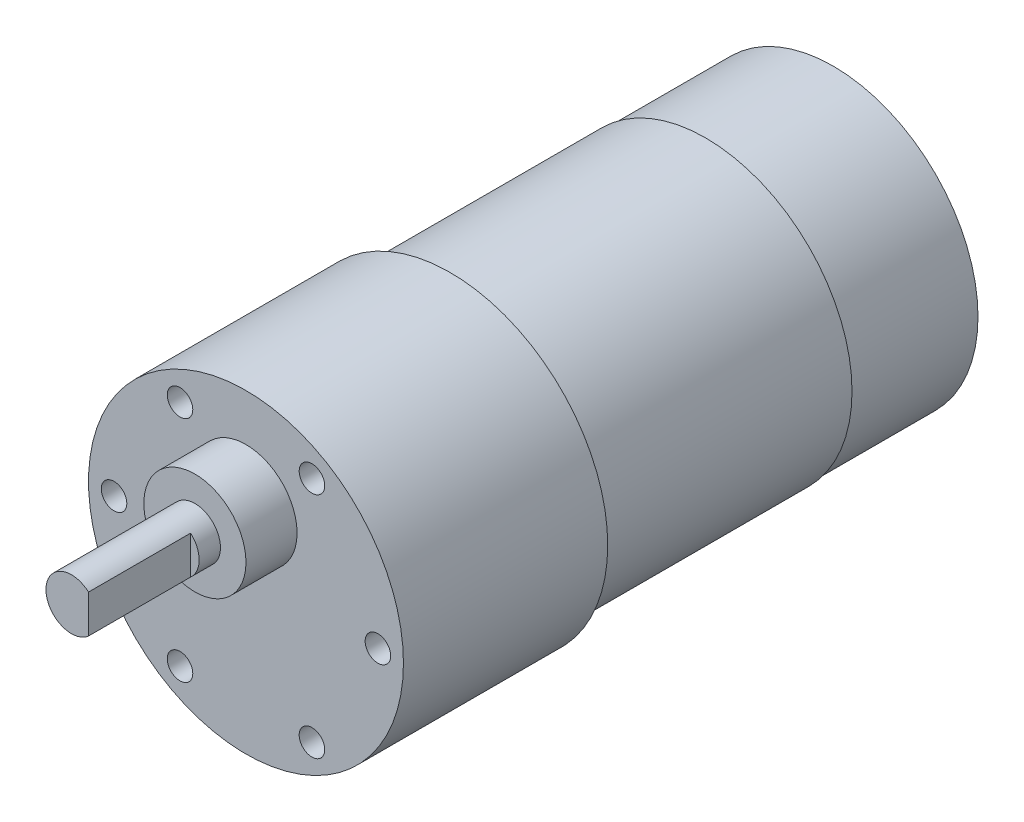
ISO-10303-21;
HEADER;
FILE_DESCRIPTION(('STEP AP214'),'2;1');
FILE_NAME('part.step','',(''),(''),'','','');
FILE_SCHEMA(('AUTOMOTIVE_DESIGN { 1 0 10303 214 1 1 1 1 }'));
ENDSEC;
DATA;
#1=APPLICATION_CONTEXT('core data for automotive mechanical design processes');
#2=APPLICATION_PROTOCOL_DEFINITION('international standard','automotive_design',2000,#1);
#3=PRODUCT_CONTEXT('',#1,'mechanical');
#4=PRODUCT('Part','Part','',(#3));
#5=PRODUCT_RELATED_PRODUCT_CATEGORY('part','',(#4));
#6=PRODUCT_DEFINITION_FORMATION('','',#4);
#7=PRODUCT_DEFINITION_CONTEXT('part definition',#1,'design');
#8=PRODUCT_DEFINITION('design','',#6,#7);
#9=PRODUCT_DEFINITION_SHAPE('','',#8);
#10=(LENGTH_UNIT() NAMED_UNIT(*) SI_UNIT(.MILLI.,.METRE.));
#11=(NAMED_UNIT(*) PLANE_ANGLE_UNIT() SI_UNIT($,.RADIAN.));
#12=(NAMED_UNIT(*) SI_UNIT($,.STERADIAN.) SOLID_ANGLE_UNIT());
#13=UNCERTAINTY_MEASURE_WITH_UNIT(LENGTH_MEASURE(1.E-05),#10,'distance_accuracy_value','');
#14=(GEOMETRIC_REPRESENTATION_CONTEXT(3) GLOBAL_UNCERTAINTY_ASSIGNED_CONTEXT((#13)) GLOBAL_UNIT_ASSIGNED_CONTEXT((#10,
#11,#12)) REPRESENTATION_CONTEXT('',''));
#15=CARTESIAN_POINT('',(0.,0.,0.));
#16=DIRECTION('',(0.,0.,1.));
#17=DIRECTION('',(1.,0.,0.));
#18=AXIS2_PLACEMENT_3D('',#15,#16,#17);
#19=CARTESIAN_POINT('',(0.,0.,-24.));
#20=DIRECTION('',(0.,0.,1.));
#21=DIRECTION('',(1.,0.,0.));
#22=AXIS2_PLACEMENT_3D('',#19,#20,#21);
#23=PLANE('',#22);
#24=CARTESIAN_POINT('',(0.,0.,-24.));
#25=DIRECTION('',(0.,0.,1.));
#26=DIRECTION('',(1.,0.,0.));
#27=AXIS2_PLACEMENT_3D('',#24,#25,#26);
#28=CIRCLE('',#27,17.2);
#29=CARTESIAN_POINT('',(17.2,0.,-24.));
#30=VERTEX_POINT('',#29);
#31=EDGE_CURVE('P0_E75',#30,#30,#28,.T.);
#32=ORIENTED_EDGE('',*,*,#31,.T.);
#33=EDGE_LOOP('',(#32));
#34=FACE_BOUND('',#33,.T.);
#35=CARTESIAN_POINT('',(0.,0.,-24.));
#36=DIRECTION('',(0.,0.,-1.));
#37=DIRECTION('',(1.,0.,0.));
#38=AXIS2_PLACEMENT_3D('',#35,#36,#37);
#39=CIRCLE('',#38,18.5);
#40=CARTESIAN_POINT('',(18.5,0.,-24.));
#41=VERTEX_POINT('',#40);
#42=EDGE_CURVE('P0_E22',#41,#41,#39,.T.);
#43=ORIENTED_EDGE('',*,*,#42,.T.);
#44=EDGE_LOOP('',(#43));
#45=FACE_BOUND('',#44,.T.);
#46=ADVANCED_FACE('P0_F15',(#34,#45),#23,.F.);
#47=CARTESIAN_POINT('',(0.,0.,0.));
#48=DIRECTION('',(0.,0.,1.));
#49=DIRECTION('',(1.,0.,0.));
#50=AXIS2_PLACEMENT_3D('',#47,#48,#49);
#51=PLANE('',#50);
#52=CARTESIAN_POINT('',(-7.75,13.4233937586588,0.));
#53=DIRECTION('',(0.,0.,-1.));
#54=DIRECTION('',(1.,0.,0.));
#55=AXIS2_PLACEMENT_3D('',#52,#53,#54);
#56=CIRCLE('',#55,1.5);
#57=CARTESIAN_POINT('',(-6.25,13.4233937586588,0.));
#58=VERTEX_POINT('',#57);
#59=EDGE_CURVE('P0_E79',#58,#58,#56,.T.);
#60=ORIENTED_EDGE('',*,*,#59,.T.);
#61=EDGE_LOOP('',(#60));
#62=FACE_BOUND('',#61,.T.);
#63=CARTESIAN_POINT('',(15.5,0.,0.));
#64=DIRECTION('',(0.,0.,-1.));
#65=DIRECTION('',(1.,0.,0.));
#66=AXIS2_PLACEMENT_3D('',#63,#64,#65);
#67=CIRCLE('',#66,1.5);
#68=CARTESIAN_POINT('',(17.,0.,0.));
#69=VERTEX_POINT('',#68);
#70=EDGE_CURVE('P0_E42',#69,#69,#67,.T.);
#71=ORIENTED_EDGE('',*,*,#70,.T.);
#72=EDGE_LOOP('',(#71));
#73=FACE_BOUND('',#72,.T.);
#74=CARTESIAN_POINT('',(7.75,-13.4233937586588,0.));
#75=DIRECTION('',(0.,0.,-1.));
#76=DIRECTION('',(1.,0.,0.));
#77=AXIS2_PLACEMENT_3D('',#74,#75,#76);
#78=CIRCLE('',#77,1.5);
#79=CARTESIAN_POINT('',(9.25,-13.4233937586588,0.));
#80=VERTEX_POINT('',#79);
#81=EDGE_CURVE('P0_E53',#80,#80,#78,.T.);
#82=ORIENTED_EDGE('',*,*,#81,.T.);
#83=EDGE_LOOP('',(#82));
#84=FACE_BOUND('',#83,.T.);
#85=CARTESIAN_POINT('',(-7.75,-13.4233937586588,0.));
#86=DIRECTION('',(0.,0.,-1.));
#87=DIRECTION('',(1.,0.,0.));
#88=AXIS2_PLACEMENT_3D('',#85,#86,#87);
#89=CIRCLE('',#88,1.5);
#90=CARTESIAN_POINT('',(-6.25,-13.4233937586588,0.));
#91=VERTEX_POINT('',#90);
#92=EDGE_CURVE('P0_E46',#91,#91,#89,.T.);
#93=ORIENTED_EDGE('',*,*,#92,.T.);
#94=EDGE_LOOP('',(#93));
#95=FACE_BOUND('',#94,.T.);
#96=CARTESIAN_POINT('',(-15.5,0.,0.));
#97=DIRECTION('',(0.,0.,-1.));
#98=DIRECTION('',(1.,0.,0.));
#99=AXIS2_PLACEMENT_3D('',#96,#97,#98);
#100=CIRCLE('',#99,1.5);
#101=CARTESIAN_POINT('',(-14.,0.,0.));
#102=VERTEX_POINT('',#101);
#103=EDGE_CURVE('P0_E39',#102,#102,#100,.T.);
#104=ORIENTED_EDGE('',*,*,#103,.T.);
#105=EDGE_LOOP('',(#104));
#106=FACE_BOUND('',#105,.T.);
#107=CARTESIAN_POINT('',(7.75,13.4233937586588,0.));
#108=DIRECTION('',(0.,0.,-1.));
#109=DIRECTION('',(1.,0.,0.));
#110=AXIS2_PLACEMENT_3D('',#107,#108,#109);
#111=CIRCLE('',#110,1.5);
#112=CARTESIAN_POINT('',(9.25,13.4233937586588,0.));
#113=VERTEX_POINT('',#112);
#114=EDGE_CURVE('P0_E31',#113,#113,#111,.T.);
#115=ORIENTED_EDGE('',*,*,#114,.T.);
#116=EDGE_LOOP('',(#115));
#117=FACE_BOUND('',#116,.T.);
#118=CARTESIAN_POINT('',(0.,0.,0.));
#119=DIRECTION('',(0.,0.,1.));
#120=DIRECTION('',(1.,0.,0.));
#121=AXIS2_PLACEMENT_3D('',#118,#119,#120);
#122=CIRCLE('',#121,18.5);
#123=CARTESIAN_POINT('',(18.5,0.,0.));
#124=VERTEX_POINT('',#123);
#125=EDGE_CURVE('P0_E10',#124,#124,#122,.T.);
#126=ORIENTED_EDGE('',*,*,#125,.T.);
#127=EDGE_LOOP('',(#126));
#128=FACE_BOUND('',#127,.T.);
#129=ADVANCED_FACE('P0_F136',(#62,#73,#84,#95,#106,#117,#128),#51,.T.);
#130=CARTESIAN_POINT('',(0.,0.,0.));
#131=DIRECTION('',(0.,0.,-1.));
#132=DIRECTION('',(1.,0.,0.));
#133=AXIS2_PLACEMENT_3D('',#130,#131,#132);
#134=CYLINDRICAL_SURFACE('',#133,18.5);
#135=ORIENTED_EDGE('',*,*,#125,.F.);
#136=EDGE_LOOP('',(#135));
#137=FACE_BOUND('',#136,.T.);
#138=ORIENTED_EDGE('',*,*,#42,.F.);
#139=EDGE_LOOP('',(#138));
#140=FACE_BOUND('',#139,.T.);
#141=ADVANCED_FACE('P0_F140',(#137,#140),#134,.T.);
#142=CARTESIAN_POINT('',(7.75,13.4233937586588,0.));
#143=DIRECTION('',(0.,0.,-1.));
#144=DIRECTION('',(1.,0.,0.));
#145=AXIS2_PLACEMENT_3D('',#142,#143,#144);
#146=CYLINDRICAL_SURFACE('',#145,1.5);
#147=CARTESIAN_POINT('',(7.75,13.4233937586588,-24.));
#148=DIRECTION('',(0.,0.,1.));
#149=DIRECTION('',(1.,0.,0.));
#150=AXIS2_PLACEMENT_3D('',#147,#148,#149);
#151=CIRCLE('',#150,1.5);
#152=CARTESIAN_POINT('',(9.25,13.4233937586588,-24.));
#153=VERTEX_POINT('',#152);
#154=EDGE_CURVE('P0_E99',#153,#153,#151,.T.);
#155=ORIENTED_EDGE('',*,*,#154,.F.);
#156=EDGE_LOOP('',(#155));
#157=FACE_BOUND('',#156,.T.);
#158=ORIENTED_EDGE('',*,*,#114,.F.);
#159=EDGE_LOOP('',(#158));
#160=FACE_BOUND('',#159,.T.);
#161=ADVANCED_FACE('P0_F131',(#157,#160),#146,.F.);
#162=CARTESIAN_POINT('',(-15.5,0.,0.));
#163=DIRECTION('',(0.,0.,-1.));
#164=DIRECTION('',(1.,0.,0.));
#165=AXIS2_PLACEMENT_3D('',#162,#163,#164);
#166=CYLINDRICAL_SURFACE('',#165,1.5);
#167=CARTESIAN_POINT('',(-15.5,0.,-24.));
#168=DIRECTION('',(0.,0.,1.));
#169=DIRECTION('',(1.,0.,0.));
#170=AXIS2_PLACEMENT_3D('',#167,#168,#169);
#171=CIRCLE('',#170,1.5);
#172=CARTESIAN_POINT('',(-14.,0.,-24.));
#173=VERTEX_POINT('',#172);
#174=EDGE_CURVE('P0_E102',#173,#173,#171,.T.);
#175=ORIENTED_EDGE('',*,*,#174,.F.);
#176=EDGE_LOOP('',(#175));
#177=FACE_BOUND('',#176,.T.);
#178=ORIENTED_EDGE('',*,*,#103,.F.);
#179=EDGE_LOOP('',(#178));
#180=FACE_BOUND('',#179,.T.);
#181=ADVANCED_FACE('P0_F121',(#177,#180),#166,.F.);
#182=CARTESIAN_POINT('',(-7.75,-13.4233937586588,0.));
#183=DIRECTION('',(0.,0.,-1.));
#184=DIRECTION('',(1.,0.,0.));
#185=AXIS2_PLACEMENT_3D('',#182,#183,#184);
#186=CYLINDRICAL_SURFACE('',#185,1.5);
#187=CARTESIAN_POINT('',(-7.75,-13.4233937586588,-24.));
#188=DIRECTION('',(0.,0.,1.));
#189=DIRECTION('',(1.,0.,0.));
#190=AXIS2_PLACEMENT_3D('',#187,#188,#189);
#191=CIRCLE('',#190,1.5);
#192=CARTESIAN_POINT('',(-6.25,-13.4233937586588,-24.));
#193=VERTEX_POINT('',#192);
#194=EDGE_CURVE('P0_E63',#193,#193,#191,.T.);
#195=ORIENTED_EDGE('',*,*,#194,.F.);
#196=EDGE_LOOP('',(#195));
#197=FACE_BOUND('',#196,.T.);
#198=ORIENTED_EDGE('',*,*,#92,.F.);
#199=EDGE_LOOP('',(#198));
#200=FACE_BOUND('',#199,.T.);
#201=ADVANCED_FACE('P0_F117',(#197,#200),#186,.F.);
#202=CARTESIAN_POINT('',(7.75,-13.4233937586588,0.));
#203=DIRECTION('',(0.,0.,-1.));
#204=DIRECTION('',(1.,0.,0.));
#205=AXIS2_PLACEMENT_3D('',#202,#203,#204);
#206=CYLINDRICAL_SURFACE('',#205,1.5);
#207=CARTESIAN_POINT('',(7.75,-13.4233937586588,-24.));
#208=DIRECTION('',(0.,0.,1.));
#209=DIRECTION('',(1.,0.,0.));
#210=AXIS2_PLACEMENT_3D('',#207,#208,#209);
#211=CIRCLE('',#210,1.5);
#212=CARTESIAN_POINT('',(9.25,-13.4233937586588,-24.));
#213=VERTEX_POINT('',#212);
#214=EDGE_CURVE('P0_E66',#213,#213,#211,.T.);
#215=ORIENTED_EDGE('',*,*,#214,.F.);
#216=EDGE_LOOP('',(#215));
#217=FACE_BOUND('',#216,.T.);
#218=ORIENTED_EDGE('',*,*,#81,.F.);
#219=EDGE_LOOP('',(#218));
#220=FACE_BOUND('',#219,.T.);
#221=ADVANCED_FACE('P0_F120',(#217,#220),#206,.F.);
#222=CARTESIAN_POINT('',(15.5,0.,0.));
#223=DIRECTION('',(0.,0.,-1.));
#224=DIRECTION('',(1.,0.,0.));
#225=AXIS2_PLACEMENT_3D('',#222,#223,#224);
#226=CYLINDRICAL_SURFACE('',#225,1.5);
#227=CARTESIAN_POINT('',(15.5,0.,-24.));
#228=DIRECTION('',(0.,0.,1.));
#229=DIRECTION('',(1.,0.,0.));
#230=AXIS2_PLACEMENT_3D('',#227,#228,#229);
#231=CIRCLE('',#230,1.5);
#232=CARTESIAN_POINT('',(17.,0.,-24.));
#233=VERTEX_POINT('',#232);
#234=EDGE_CURVE('P0_E70',#233,#233,#231,.T.);
#235=ORIENTED_EDGE('',*,*,#234,.F.);
#236=EDGE_LOOP('',(#235));
#237=FACE_BOUND('',#236,.T.);
#238=ORIENTED_EDGE('',*,*,#70,.F.);
#239=EDGE_LOOP('',(#238));
#240=FACE_BOUND('',#239,.T.);
#241=ADVANCED_FACE('P0_F128',(#237,#240),#226,.F.);
#242=CARTESIAN_POINT('',(-7.75,13.4233937586588,0.));
#243=DIRECTION('',(0.,0.,-1.));
#244=DIRECTION('',(1.,0.,0.));
#245=AXIS2_PLACEMENT_3D('',#242,#243,#244);
#246=CYLINDRICAL_SURFACE('',#245,1.5);
#247=CARTESIAN_POINT('',(-7.75,13.4233937586588,-24.));
#248=DIRECTION('',(0.,0.,1.));
#249=DIRECTION('',(1.,0.,0.));
#250=AXIS2_PLACEMENT_3D('',#247,#248,#249);
#251=CIRCLE('',#250,1.5);
#252=CARTESIAN_POINT('',(-6.25,13.4233937586588,-24.));
#253=VERTEX_POINT('',#252);
#254=EDGE_CURVE('P0_E76',#253,#253,#251,.T.);
#255=ORIENTED_EDGE('',*,*,#254,.F.);
#256=EDGE_LOOP('',(#255));
#257=FACE_BOUND('',#256,.T.);
#258=ORIENTED_EDGE('',*,*,#59,.F.);
#259=EDGE_LOOP('',(#258));
#260=FACE_BOUND('',#259,.T.);
#261=ADVANCED_FACE('P0_F153',(#257,#260),#246,.F.);
#262=CARTESIAN_POINT('',(0.,0.,-54.));
#263=DIRECTION('',(0.,0.,-1.));
#264=DIRECTION('',(0.,-1.,0.));
#265=AXIS2_PLACEMENT_3D('',#262,#263,#264);
#266=PLANE('',#265);
#267=CARTESIAN_POINT('',(0.,0.,-54.));
#268=DIRECTION('',(0.,0.,-1.));
#269=DIRECTION('',(1.,0.,0.));
#270=AXIS2_PLACEMENT_3D('',#267,#268,#269);
#271=CIRCLE('',#270,17.2);
#272=CARTESIAN_POINT('',(17.2,0.,-54.));
#273=VERTEX_POINT('',#272);
#274=EDGE_CURVE('P0_E71',#273,#273,#271,.T.);
#275=ORIENTED_EDGE('',*,*,#274,.T.);
#276=EDGE_LOOP('',(#275));
#277=FACE_BOUND('',#276,.T.);
#278=ADVANCED_FACE('P0_F151',(#277),#266,.T.);
#279=CARTESIAN_POINT('',(0.,0.,-24.));
#280=DIRECTION('',(0.,0.,-1.));
#281=DIRECTION('',(1.,0.,0.));
#282=AXIS2_PLACEMENT_3D('',#279,#280,#281);
#283=CYLINDRICAL_SURFACE('',#282,17.2);
#284=ORIENTED_EDGE('',*,*,#31,.F.);
#285=EDGE_LOOP('',(#284));
#286=FACE_BOUND('',#285,.T.);
#287=ORIENTED_EDGE('',*,*,#274,.F.);
#288=EDGE_LOOP('',(#287));
#289=FACE_BOUND('',#288,.T.);
#290=ADVANCED_FACE('P0_F149',(#286,#289),#283,.T.);
#291=CARTESIAN_POINT('',(0.,0.,-24.));
#292=DIRECTION('',(0.,0.,-1.));
#293=DIRECTION('',(0.,-1.,0.));
#294=AXIS2_PLACEMENT_3D('',#291,#292,#293);
#295=PLANE('',#294);
#296=ORIENTED_EDGE('',*,*,#254,.T.);
#297=EDGE_LOOP('',(#296));
#298=FACE_BOUND('',#297,.T.);
#299=ADVANCED_FACE('P0_F159',(#298),#295,.F.);
#300=CARTESIAN_POINT('',(0.,0.,-24.));
#301=DIRECTION('',(0.,0.,-1.));
#302=DIRECTION('',(0.,-1.,0.));
#303=AXIS2_PLACEMENT_3D('',#300,#301,#302);
#304=PLANE('',#303);
#305=ORIENTED_EDGE('',*,*,#234,.T.);
#306=EDGE_LOOP('',(#305));
#307=FACE_BOUND('',#306,.T.);
#308=ADVANCED_FACE('P0_F173',(#307),#304,.F.);
#309=CARTESIAN_POINT('',(0.,0.,-24.));
#310=DIRECTION('',(0.,0.,-1.));
#311=DIRECTION('',(0.,-1.,0.));
#312=AXIS2_PLACEMENT_3D('',#309,#310,#311);
#313=PLANE('',#312);
#314=ORIENTED_EDGE('',*,*,#214,.T.);
#315=EDGE_LOOP('',(#314));
#316=FACE_BOUND('',#315,.T.);
#317=ADVANCED_FACE('P0_F178',(#316),#313,.F.);
#318=CARTESIAN_POINT('',(0.,0.,-24.));
#319=DIRECTION('',(0.,0.,-1.));
#320=DIRECTION('',(0.,-1.,0.));
#321=AXIS2_PLACEMENT_3D('',#318,#319,#320);
#322=PLANE('',#321);
#323=ORIENTED_EDGE('',*,*,#194,.T.);
#324=EDGE_LOOP('',(#323));
#325=FACE_BOUND('',#324,.T.);
#326=ADVANCED_FACE('P0_F115',(#325),#322,.F.);
#327=CARTESIAN_POINT('',(0.,0.,-24.));
#328=DIRECTION('',(0.,0.,-1.));
#329=DIRECTION('',(0.,-1.,0.));
#330=AXIS2_PLACEMENT_3D('',#327,#328,#329);
#331=PLANE('',#330);
#332=ORIENTED_EDGE('',*,*,#174,.T.);
#333=EDGE_LOOP('',(#332));
#334=FACE_BOUND('',#333,.T.);
#335=ADVANCED_FACE('P0_F193',(#334),#331,.F.);
#336=CARTESIAN_POINT('',(0.,0.,-24.));
#337=DIRECTION('',(0.,0.,-1.));
#338=DIRECTION('',(0.,-1.,0.));
#339=AXIS2_PLACEMENT_3D('',#336,#337,#338);
#340=PLANE('',#339);
#341=ORIENTED_EDGE('',*,*,#154,.T.);
#342=EDGE_LOOP('',(#341));
#343=FACE_BOUND('',#342,.T.);
#344=ADVANCED_FACE('P0_F191',(#343),#340,.F.);
#345=CLOSED_SHELL('',(#46,#129,#141,#161,#181,#201,#221,#241,#261,#278,#290,#299,#308,#317,#326,
#335,#344));
#346=MANIFOLD_SOLID_BREP('P0_B1',#345);
#347=CARTESIAN_POINT('',(0.,7.,0.));
#348=DIRECTION('',(0.,0.,1.));
#349=DIRECTION('',(1.,0.,0.));
#350=AXIS2_PLACEMENT_3D('',#347,#348,#349);
#351=PLANE('',#350);
#352=CARTESIAN_POINT('',(0.,7.,0.));
#353=DIRECTION('',(0.,0.,-1.));
#354=DIRECTION('',(1.,0.,0.));
#355=AXIS2_PLACEMENT_3D('',#352,#353,#354);
#356=CIRCLE('',#355,3.);
#357=CARTESIAN_POINT('',(3.,7.,0.));
#358=VERTEX_POINT('',#357);
#359=EDGE_CURVE('P1_E38',#358,#358,#356,.T.);
#360=ORIENTED_EDGE('',*,*,#359,.F.);
#361=EDGE_LOOP('',(#360));
#362=FACE_BOUND('',#361,.T.);
#363=CARTESIAN_POINT('',(0.,7.,0.));
#364=DIRECTION('',(0.,0.,1.));
#365=DIRECTION('',(1.,0.,0.));
#366=AXIS2_PLACEMENT_3D('',#363,#364,#365);
#367=CIRCLE('',#366,6.);
#368=CARTESIAN_POINT('',(6.,7.,0.));
#369=VERTEX_POINT('',#368);
#370=EDGE_CURVE('P1_E10',#369,#369,#367,.T.);
#371=ORIENTED_EDGE('',*,*,#370,.F.);
#372=EDGE_LOOP('',(#371));
#373=FACE_BOUND('',#372,.T.);
#374=ADVANCED_FACE('P1_F15',(#362,#373),#351,.F.);
#375=CARTESIAN_POINT('',(0.,7.,6.));
#376=DIRECTION('',(0.,0.,1.));
#377=DIRECTION('',(1.,0.,0.));
#378=AXIS2_PLACEMENT_3D('',#375,#376,#377);
#379=PLANE('',#378);
#380=CARTESIAN_POINT('',(0.,7.,6.));
#381=DIRECTION('',(0.,0.,-1.));
#382=DIRECTION('',(1.,0.,0.));
#383=AXIS2_PLACEMENT_3D('',#380,#381,#382);
#384=CIRCLE('',#383,3.);
#385=CARTESIAN_POINT('',(3.,7.,6.));
#386=VERTEX_POINT('',#385);
#387=EDGE_CURVE('P1_E31',#386,#386,#384,.T.);
#388=ORIENTED_EDGE('',*,*,#387,.T.);
#389=EDGE_LOOP('',(#388));
#390=FACE_BOUND('',#389,.T.);
#391=CARTESIAN_POINT('',(0.,7.,6.));
#392=DIRECTION('',(0.,0.,1.));
#393=DIRECTION('',(1.,0.,0.));
#394=AXIS2_PLACEMENT_3D('',#391,#392,#393);
#395=CIRCLE('',#394,6.);
#396=CARTESIAN_POINT('',(6.,7.,6.));
#397=VERTEX_POINT('',#396);
#398=EDGE_CURVE('P1_E22',#397,#397,#395,.T.);
#399=ORIENTED_EDGE('',*,*,#398,.T.);
#400=EDGE_LOOP('',(#399));
#401=FACE_BOUND('',#400,.T.);
#402=ADVANCED_FACE('P1_F51',(#390,#401),#379,.T.);
#403=CARTESIAN_POINT('',(0.,7.,0.));
#404=DIRECTION('',(0.,0.,1.));
#405=DIRECTION('',(1.,0.,0.));
#406=AXIS2_PLACEMENT_3D('',#403,#404,#405);
#407=CYLINDRICAL_SURFACE('',#406,6.);
#408=ORIENTED_EDGE('',*,*,#370,.T.);
#409=EDGE_LOOP('',(#408));
#410=FACE_BOUND('',#409,.T.);
#411=ORIENTED_EDGE('',*,*,#398,.F.);
#412=EDGE_LOOP('',(#411));
#413=FACE_BOUND('',#412,.T.);
#414=ADVANCED_FACE('P1_F56',(#410,#413),#407,.T.);
#415=CARTESIAN_POINT('',(0.,7.,0.));
#416=DIRECTION('',(0.,0.,1.));
#417=DIRECTION('',(1.,0.,0.));
#418=AXIS2_PLACEMENT_3D('',#415,#416,#417);
#419=CYLINDRICAL_SURFACE('',#418,3.);
#420=ORIENTED_EDGE('',*,*,#387,.F.);
#421=EDGE_LOOP('',(#420));
#422=FACE_BOUND('',#421,.T.);
#423=ORIENTED_EDGE('',*,*,#359,.T.);
#424=EDGE_LOOP('',(#423));
#425=FACE_BOUND('',#424,.T.);
#426=ADVANCED_FACE('P1_F47',(#422,#425),#419,.F.);
#427=CLOSED_SHELL('',(#374,#402,#414,#426));
#428=MANIFOLD_SOLID_BREP('P1_B1',#427);
#429=CARTESIAN_POINT('',(0.,7.,0.));
#430=DIRECTION('',(0.,0.,1.));
#431=DIRECTION('',(1.,0.,0.));
#432=AXIS2_PLACEMENT_3D('',#429,#430,#431);
#433=PLANE('',#432);
#434=CARTESIAN_POINT('',(0.,7.,0.));
#435=DIRECTION('',(0.,0.,1.));
#436=DIRECTION('',(1.,0.,0.));
#437=AXIS2_PLACEMENT_3D('',#434,#435,#436);
#438=CIRCLE('',#437,3.);
#439=CARTESIAN_POINT('',(3.,7.,0.));
#440=VERTEX_POINT('',#439);
#441=EDGE_CURVE('P2_E11',#440,#440,#438,.T.);
#442=ORIENTED_EDGE('',*,*,#441,.F.);
#443=EDGE_LOOP('',(#442));
#444=FACE_BOUND('',#443,.T.);
#445=ADVANCED_FACE('P2_F17',(#444),#433,.F.);
#446=CARTESIAN_POINT('',(0.,7.,20.5));
#447=DIRECTION('',(0.,0.,1.));
#448=DIRECTION('',(1.,0.,0.));
#449=AXIS2_PLACEMENT_3D('',#446,#447,#448);
#450=PLANE('',#449);
#451=DIRECTION('',(0.,1.,0.));
#452=VECTOR('',#451,1.);
#453=CARTESIAN_POINT('',(2.00000002980232,5.8819660245781,20.5));
#454=LINE('',#453,#452);
#455=CARTESIAN_POINT('',(2.00000002980232,4.76393204915622,20.5));
#456=VERTEX_POINT('',#455);
#457=CARTESIAN_POINT('',(2.00000002980232,9.23606795084379,20.5));
#458=VERTEX_POINT('',#457);
#459=EDGE_CURVE('P2_E55',#456,#458,#454,.T.);
#460=ORIENTED_EDGE('',*,*,#459,.T.);
#461=CARTESIAN_POINT('',(0.,7.,20.5));
#462=DIRECTION('',(0.,0.,1.));
#463=DIRECTION('',(1.,0.,0.));
#464=AXIS2_PLACEMENT_3D('',#461,#462,#463);
#465=CIRCLE('',#464,3.);
#466=EDGE_CURVE('P2_E25',#458,#456,#465,.T.);
#467=ORIENTED_EDGE('',*,*,#466,.T.);
#468=EDGE_LOOP('',(#460,#467));
#469=FACE_BOUND('',#468,.T.);
#470=ADVANCED_FACE('P2_F53',(#469),#450,.T.);
#471=CARTESIAN_POINT('',(0.,7.,0.));
#472=DIRECTION('',(0.,0.,1.));
#473=DIRECTION('',(1.,0.,0.));
#474=AXIS2_PLACEMENT_3D('',#471,#472,#473);
#475=CYLINDRICAL_SURFACE('',#474,3.);
#476=ORIENTED_EDGE('',*,*,#441,.T.);
#477=EDGE_LOOP('',(#476));
#478=FACE_BOUND('',#477,.T.);
#479=ORIENTED_EDGE('',*,*,#466,.F.);
#480=DIRECTION('',(0.,0.,-1.));
#481=VECTOR('',#480,1.);
#482=CARTESIAN_POINT('',(2.00000002980232,9.23606795084379,0.));
#483=LINE('',#482,#481);
#484=CARTESIAN_POINT('',(2.00000002980232,9.23606795084379,8.5));
#485=VERTEX_POINT('',#484);
#486=EDGE_CURVE('P2_E67',#458,#485,#483,.T.);
#487=ORIENTED_EDGE('',*,*,#486,.T.);
#488=CARTESIAN_POINT('',(0.,7.,8.5));
#489=DIRECTION('',(0.,0.,-1.));
#490=DIRECTION('',(1.,0.,0.));
#491=AXIS2_PLACEMENT_3D('',#488,#489,#490);
#492=CIRCLE('',#491,3.);
#493=CARTESIAN_POINT('',(2.00000002980232,4.76393204915622,8.5));
#494=VERTEX_POINT('',#493);
#495=EDGE_CURVE('P2_E36',#485,#494,#492,.T.);
#496=ORIENTED_EDGE('',*,*,#495,.T.);
#497=DIRECTION('',(0.,0.,1.));
#498=VECTOR('',#497,1.);
#499=CARTESIAN_POINT('',(2.00000002980232,4.76393204915622,0.));
#500=LINE('',#499,#498);
#501=EDGE_CURVE('P2_E59',#494,#456,#500,.T.);
#502=ORIENTED_EDGE('',*,*,#501,.T.);
#503=EDGE_LOOP('',(#479,#487,#496,#502));
#504=FACE_BOUND('',#503,.T.);
#505=ADVANCED_FACE('P2_F60',(#478,#504),#475,.T.);
#506=CARTESIAN_POINT('',(2.50000001490116,7.,8.5));
#507=DIRECTION('',(0.,0.,1.));
#508=DIRECTION('',(1.,0.,0.));
#509=AXIS2_PLACEMENT_3D('',#506,#507,#508);
#510=PLANE('',#509);
#511=ORIENTED_EDGE('',*,*,#495,.F.);
#512=DIRECTION('',(0.,1.,0.));
#513=VECTOR('',#512,1.);
#514=CARTESIAN_POINT('',(2.00000002980232,6.50000009685755,8.5));
#515=LINE('',#514,#513);
#516=EDGE_CURVE('P2_E64',#494,#485,#515,.T.);
#517=ORIENTED_EDGE('',*,*,#516,.F.);
#518=EDGE_LOOP('',(#511,#517));
#519=FACE_BOUND('',#518,.T.);
#520=ADVANCED_FACE('P2_F109',(#519),#510,.T.);
#521=CARTESIAN_POINT('',(2.00000002980232,4.76393204915622,20.5));
#522=DIRECTION('',(-1.,0.,0.));
#523=DIRECTION('',(0.,0.,1.));
#524=AXIS2_PLACEMENT_3D('',#521,#522,#523);
#525=PLANE('',#524);
#526=ORIENTED_EDGE('',*,*,#459,.F.);
#527=ORIENTED_EDGE('',*,*,#501,.F.);
#528=ORIENTED_EDGE('',*,*,#516,.T.);
#529=ORIENTED_EDGE('',*,*,#486,.F.);
#530=EDGE_LOOP('',(#526,#527,#528,#529));
#531=FACE_BOUND('',#530,.T.);
#532=ADVANCED_FACE('P2_F66',(#531),#525,.F.);
#533=CLOSED_SHELL('',(#445,#470,#505,#520,#532));
#534=MANIFOLD_SOLID_BREP('P2_B1',#533);
#535=CARTESIAN_POINT('',(0.,0.,-54.));
#536=DIRECTION('',(0.,0.,-1.));
#537=DIRECTION('',(0.,-1.,0.));
#538=AXIS2_PLACEMENT_3D('',#535,#536,#537);
#539=PLANE('',#538);
#540=CARTESIAN_POINT('',(0.,0.,-54.));
#541=DIRECTION('',(0.,0.,-1.));
#542=DIRECTION('',(1.,0.,0.));
#543=AXIS2_PLACEMENT_3D('',#540,#541,#542);
#544=CIRCLE('',#543,17.);
#545=CARTESIAN_POINT('',(17.,0.,-54.));
#546=VERTEX_POINT('',#545);
#547=EDGE_CURVE('P3_E10',#546,#546,#544,.T.);
#548=ORIENTED_EDGE('',*,*,#547,.F.);
#549=EDGE_LOOP('',(#548));
#550=FACE_BOUND('',#549,.T.);
#551=ADVANCED_FACE('P3_F15',(#550),#539,.F.);
#552=CARTESIAN_POINT('',(0.,0.,-69.));
#553=DIRECTION('',(0.,0.,-1.));
#554=DIRECTION('',(0.,-1.,0.));
#555=AXIS2_PLACEMENT_3D('',#552,#553,#554);
#556=PLANE('',#555);
#557=CARTESIAN_POINT('',(0.,0.,-69.));
#558=DIRECTION('',(0.,0.,-1.));
#559=DIRECTION('',(1.,0.,0.));
#560=AXIS2_PLACEMENT_3D('',#557,#558,#559);
#561=CIRCLE('',#560,17.);
#562=CARTESIAN_POINT('',(17.,0.,-69.));
#563=VERTEX_POINT('',#562);
#564=EDGE_CURVE('P3_E23',#563,#563,#561,.T.);
#565=ORIENTED_EDGE('',*,*,#564,.T.);
#566=EDGE_LOOP('',(#565));
#567=FACE_BOUND('',#566,.T.);
#568=ADVANCED_FACE('P3_F17',(#567),#556,.T.);
#569=CARTESIAN_POINT('',(0.,0.,-54.));
#570=DIRECTION('',(0.,0.,-1.));
#571=DIRECTION('',(1.,0.,0.));
#572=AXIS2_PLACEMENT_3D('',#569,#570,#571);
#573=CYLINDRICAL_SURFACE('',#572,17.);
#574=ORIENTED_EDGE('',*,*,#547,.T.);
#575=EDGE_LOOP('',(#574));
#576=FACE_BOUND('',#575,.T.);
#577=ORIENTED_EDGE('',*,*,#564,.F.);
#578=EDGE_LOOP('',(#577));
#579=FACE_BOUND('',#578,.T.);
#580=ADVANCED_FACE('P3_F37',(#576,#579),#573,.T.);
#581=CLOSED_SHELL('',(#551,#568,#580));
#582=MANIFOLD_SOLID_BREP('P3_B1',#581);
#583=ADVANCED_BREP_SHAPE_REPRESENTATION('',(#18,#346,#428,#534,#582),#14);
#584=SHAPE_DEFINITION_REPRESENTATION(#9,#583);
ENDSEC;
END-ISO-10303-21;
